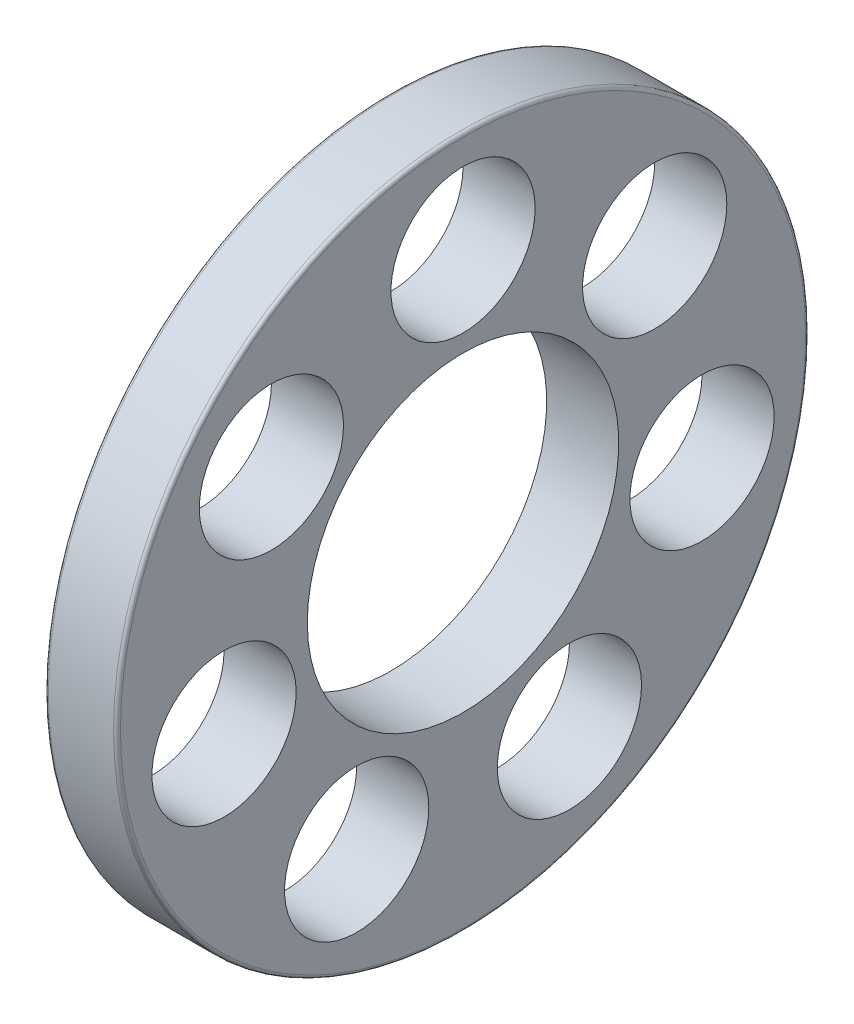
ISO-10303-21;
HEADER;
FILE_DESCRIPTION(('STEP AP214'),'2;1');
FILE_NAME('part.step','',(''),(''),'','','');
FILE_SCHEMA(('AUTOMOTIVE_DESIGN { 1 0 10303 214 1 1 1 1 }'));
ENDSEC;
DATA;
#1=APPLICATION_CONTEXT('core data for automotive mechanical design processes');
#2=APPLICATION_PROTOCOL_DEFINITION('international standard','automotive_design',2000,#1);
#3=PRODUCT_CONTEXT('',#1,'mechanical');
#4=PRODUCT('Part','Part','',(#3));
#5=PRODUCT_RELATED_PRODUCT_CATEGORY('part','',(#4));
#6=PRODUCT_DEFINITION_FORMATION('','',#4);
#7=PRODUCT_DEFINITION_CONTEXT('part definition',#1,'design');
#8=PRODUCT_DEFINITION('design','',#6,#7);
#9=PRODUCT_DEFINITION_SHAPE('','',#8);
#10=(LENGTH_UNIT() NAMED_UNIT(*) SI_UNIT(.MILLI.,.METRE.));
#11=(NAMED_UNIT(*) PLANE_ANGLE_UNIT() SI_UNIT($,.RADIAN.));
#12=(NAMED_UNIT(*) SI_UNIT($,.STERADIAN.) SOLID_ANGLE_UNIT());
#13=UNCERTAINTY_MEASURE_WITH_UNIT(LENGTH_MEASURE(1.E-05),#10,'distance_accuracy_value','');
#14=(GEOMETRIC_REPRESENTATION_CONTEXT(3) GLOBAL_UNCERTAINTY_ASSIGNED_CONTEXT((#13)) GLOBAL_UNIT_ASSIGNED_CONTEXT((#10,
#11,#12)) REPRESENTATION_CONTEXT('',''));
#15=CARTESIAN_POINT('',(0.,0.,0.));
#16=DIRECTION('',(0.,0.,1.));
#17=DIRECTION('',(1.,0.,0.));
#18=AXIS2_PLACEMENT_3D('',#15,#16,#17);
#19=CARTESIAN_POINT('',(9.17499999999999,0.,0.));
#20=DIRECTION('',(1.,0.,0.));
#21=DIRECTION('',(0.,0.,-1.));
#22=AXIS2_PLACEMENT_3D('',#19,#20,#21);
#23=TOROIDAL_SURFACE('',#22,29.7,0.299999999999995);
#24=CARTESIAN_POINT('',(9.175,0.,0.));
#25=DIRECTION('',(-1.,0.,0.));
#26=DIRECTION('',(0.,0.,1.));
#27=AXIS2_PLACEMENT_3D('',#24,#25,#26);
#28=CIRCLE('',#27,30.);
#29=CARTESIAN_POINT('',(9.175,0.,30.));
#30=VERTEX_POINT('',#29);
#31=EDGE_CURVE('E85',#30,#30,#28,.F.);
#32=ORIENTED_EDGE('',*,*,#31,.F.);
#33=EDGE_LOOP('',(#32));
#34=FACE_BOUND('',#33,.T.);
#35=CARTESIAN_POINT('',(8.875,0.,0.));
#36=DIRECTION('',(1.,0.,0.));
#37=DIRECTION('',(0.,0.,-1.));
#38=AXIS2_PLACEMENT_3D('',#35,#36,#37);
#39=CIRCLE('',#38,29.7);
#40=CARTESIAN_POINT('',(8.875,0.,-29.7));
#41=VERTEX_POINT('',#40);
#42=EDGE_CURVE('E80',#41,#41,#39,.F.);
#43=ORIENTED_EDGE('',*,*,#42,.F.);
#44=EDGE_LOOP('',(#43));
#45=FACE_BOUND('',#44,.T.);
#46=ADVANCED_FACE('F15',(#34,#45),#23,.T.);
#47=CARTESIAN_POINT('',(15.125,0.,0.));
#48=DIRECTION('',(-1.,0.,0.));
#49=DIRECTION('',(0.,0.,1.));
#50=AXIS2_PLACEMENT_3D('',#47,#48,#49);
#51=CYLINDRICAL_SURFACE('',#50,30.);
#52=CARTESIAN_POINT('',(14.825,0.,0.));
#53=DIRECTION('',(1.,0.,0.));
#54=DIRECTION('',(0.,0.,-1.));
#55=AXIS2_PLACEMENT_3D('',#52,#53,#54);
#56=CIRCLE('',#55,30.);
#57=CARTESIAN_POINT('',(14.825,0.,-30.));
#58=VERTEX_POINT('',#57);
#59=EDGE_CURVE('E76',#58,#58,#56,.T.);
#60=ORIENTED_EDGE('',*,*,#59,.F.);
#61=EDGE_LOOP('',(#60));
#62=FACE_BOUND('',#61,.T.);
#63=ORIENTED_EDGE('',*,*,#31,.T.);
#64=EDGE_LOOP('',(#63));
#65=FACE_BOUND('',#64,.T.);
#66=ADVANCED_FACE('F116',(#62,#65),#51,.T.);
#67=CARTESIAN_POINT('',(8.875,29.7,0.));
#68=DIRECTION('',(-1.,0.,0.));
#69=DIRECTION('',(0.,0.,1.));
#70=AXIS2_PLACEMENT_3D('',#67,#68,#69);
#71=PLANE('',#70);
#72=ORIENTED_EDGE('',*,*,#42,.T.);
#73=EDGE_LOOP('',(#72));
#74=FACE_BOUND('',#73,.T.);
#75=CARTESIAN_POINT('',(8.875,13.2491582894981,16.6139190024456));
#76=DIRECTION('',(1.,0.,0.));
#77=DIRECTION('',(0.,0.,-1.));
#78=AXIS2_PLACEMENT_3D('',#75,#76,#77);
#79=CIRCLE('',#78,6.25);
#80=CARTESIAN_POINT('',(8.875,13.2491582894981,10.3639190024456));
#81=VERTEX_POINT('',#80);
#82=EDGE_CURVE('E57',#81,#81,#79,.T.);
#83=ORIENTED_EDGE('',*,*,#82,.T.);
#84=EDGE_LOOP('',(#83));
#85=FACE_BOUND('',#84,.T.);
#86=CARTESIAN_POINT('',(8.875,-4.72856984657168,20.7172181338638));
#87=DIRECTION('',(1.,0.,0.));
#88=DIRECTION('',(0.,0.,-1.));
#89=AXIS2_PLACEMENT_3D('',#86,#87,#88);
#90=CIRCLE('',#89,6.25);
#91=CARTESIAN_POINT('',(8.875,-4.72856984657168,14.4672181338638));
#92=VERTEX_POINT('',#91);
#93=EDGE_CURVE('E60',#92,#92,#90,.T.);
#94=ORIENTED_EDGE('',*,*,#93,.T.);
#95=EDGE_LOOP('',(#94));
#96=FACE_BOUND('',#95,.T.);
#97=CARTESIAN_POINT('',(8.875,-19.1455884429264,9.22002945624811));
#98=DIRECTION('',(1.,0.,0.));
#99=DIRECTION('',(0.,0.,-1.));
#100=AXIS2_PLACEMENT_3D('',#97,#98,#99);
#101=CIRCLE('',#100,6.25);
#102=CARTESIAN_POINT('',(8.875,-19.1455884429264,2.97002945624811));
#103=VERTEX_POINT('',#102);
#104=EDGE_CURVE('E63',#103,#103,#101,.T.);
#105=ORIENTED_EDGE('',*,*,#104,.T.);
#106=EDGE_LOOP('',(#105));
#107=FACE_BOUND('',#106,.T.);
#108=CARTESIAN_POINT('',(8.875,-19.1455884429264,-9.22002945624811));
#109=DIRECTION('',(1.,0.,0.));
#110=DIRECTION('',(0.,0.,-1.));
#111=AXIS2_PLACEMENT_3D('',#108,#109,#110);
#112=CIRCLE('',#111,6.25);
#113=CARTESIAN_POINT('',(8.875,-19.1455884429264,-15.4700294562481));
#114=VERTEX_POINT('',#113);
#115=EDGE_CURVE('E66',#114,#114,#112,.T.);
#116=ORIENTED_EDGE('',*,*,#115,.T.);
#117=EDGE_LOOP('',(#116));
#118=FACE_BOUND('',#117,.T.);
#119=CARTESIAN_POINT('',(8.875,-4.72856984657169,-20.7172181338638));
#120=DIRECTION('',(1.,0.,0.));
#121=DIRECTION('',(0.,0.,-1.));
#122=AXIS2_PLACEMENT_3D('',#119,#120,#121);
#123=CIRCLE('',#122,6.25);
#124=CARTESIAN_POINT('',(8.875,-4.72856984657169,-26.9672181338638));
#125=VERTEX_POINT('',#124);
#126=EDGE_CURVE('E69',#125,#125,#123,.T.);
#127=ORIENTED_EDGE('',*,*,#126,.T.);
#128=EDGE_LOOP('',(#127));
#129=FACE_BOUND('',#128,.T.);
#130=CARTESIAN_POINT('',(8.875,13.2491582894981,-16.6139190024456));
#131=DIRECTION('',(1.,0.,0.));
#132=DIRECTION('',(0.,0.,-1.));
#133=AXIS2_PLACEMENT_3D('',#130,#131,#132);
#134=CIRCLE('',#133,6.25);
#135=CARTESIAN_POINT('',(8.875,13.2491582894981,-22.8639190024456));
#136=VERTEX_POINT('',#135);
#137=EDGE_CURVE('E71',#136,#136,#134,.T.);
#138=ORIENTED_EDGE('',*,*,#137,.T.);
#139=EDGE_LOOP('',(#138));
#140=FACE_BOUND('',#139,.T.);
#141=CARTESIAN_POINT('',(8.875,21.25,0.));
#142=DIRECTION('',(1.,0.,0.));
#143=DIRECTION('',(0.,0.,-1.));
#144=AXIS2_PLACEMENT_3D('',#141,#142,#143);
#145=CIRCLE('',#144,6.25);
#146=CARTESIAN_POINT('',(8.875,21.25,-6.25));
#147=VERTEX_POINT('',#146);
#148=EDGE_CURVE('E20',#147,#147,#145,.T.);
#149=ORIENTED_EDGE('',*,*,#148,.T.);
#150=EDGE_LOOP('',(#149));
#151=FACE_BOUND('',#150,.T.);
#152=CARTESIAN_POINT('',(8.875,0.,0.));
#153=DIRECTION('',(-1.,0.,0.));
#154=DIRECTION('',(0.,0.,1.));
#155=AXIS2_PLACEMENT_3D('',#152,#153,#154);
#156=CIRCLE('',#155,13.5);
#157=CARTESIAN_POINT('',(8.875,0.,13.5));
#158=VERTEX_POINT('',#157);
#159=EDGE_CURVE('E54',#158,#158,#156,.F.);
#160=ORIENTED_EDGE('',*,*,#159,.T.);
#161=EDGE_LOOP('',(#160));
#162=FACE_BOUND('',#161,.T.);
#163=ADVANCED_FACE('F112',(#74,#85,#96,#107,#118,#129,#140,#151,#162),#71,.T.);
#164=CARTESIAN_POINT('',(14.825,0.,0.));
#165=DIRECTION('',(1.,0.,0.));
#166=DIRECTION('',(0.,0.,-1.));
#167=AXIS2_PLACEMENT_3D('',#164,#165,#166);
#168=TOROIDAL_SURFACE('',#167,29.7,0.299999999999993);
#169=CARTESIAN_POINT('',(15.125,0.,0.));
#170=DIRECTION('',(-1.,0.,0.));
#171=DIRECTION('',(0.,0.,-1.));
#172=AXIS2_PLACEMENT_3D('',#169,#170,#171);
#173=CIRCLE('',#172,29.7);
#174=CARTESIAN_POINT('',(15.125,0.,-29.7));
#175=VERTEX_POINT('',#174);
#176=EDGE_CURVE('E53',#175,#175,#173,.F.);
#177=ORIENTED_EDGE('',*,*,#176,.F.);
#178=EDGE_LOOP('',(#177));
#179=FACE_BOUND('',#178,.T.);
#180=ORIENTED_EDGE('',*,*,#59,.T.);
#181=EDGE_LOOP('',(#180));
#182=FACE_BOUND('',#181,.T.);
#183=ADVANCED_FACE('F101',(#179,#182),#168,.T.);
#184=CARTESIAN_POINT('',(24.,21.25,0.));
#185=DIRECTION('',(1.,0.,0.));
#186=DIRECTION('',(0.,0.,-1.));
#187=AXIS2_PLACEMENT_3D('',#184,#185,#186);
#188=CYLINDRICAL_SURFACE('',#187,6.25);
#189=CARTESIAN_POINT('',(15.125,21.25,0.));
#190=DIRECTION('',(1.,0.,0.));
#191=DIRECTION('',(0.,0.,-1.));
#192=AXIS2_PLACEMENT_3D('',#189,#190,#191);
#193=CIRCLE('',#192,6.25);
#194=CARTESIAN_POINT('',(15.125,21.25,-6.25));
#195=VERTEX_POINT('',#194);
#196=EDGE_CURVE('E50',#195,#195,#193,.F.);
#197=ORIENTED_EDGE('',*,*,#196,.F.);
#198=EDGE_LOOP('',(#197));
#199=FACE_BOUND('',#198,.T.);
#200=ORIENTED_EDGE('',*,*,#148,.F.);
#201=EDGE_LOOP('',(#200));
#202=FACE_BOUND('',#201,.T.);
#203=ADVANCED_FACE('F111',(#199,#202),#188,.F.);
#204=CARTESIAN_POINT('',(24.,13.2491582894981,-16.6139190024456));
#205=DIRECTION('',(1.,0.,0.));
#206=DIRECTION('',(0.,0.,-1.));
#207=AXIS2_PLACEMENT_3D('',#204,#205,#206);
#208=CYLINDRICAL_SURFACE('',#207,6.25);
#209=CARTESIAN_POINT('',(15.125,13.2491582894981,-16.6139190024456));
#210=DIRECTION('',(1.,0.,0.));
#211=DIRECTION('',(0.,0.,-1.));
#212=AXIS2_PLACEMENT_3D('',#209,#210,#211);
#213=CIRCLE('',#212,6.25);
#214=CARTESIAN_POINT('',(15.125,13.2491582894981,-22.8639190024456));
#215=VERTEX_POINT('',#214);
#216=EDGE_CURVE('E47',#215,#215,#213,.F.);
#217=ORIENTED_EDGE('',*,*,#216,.F.);
#218=EDGE_LOOP('',(#217));
#219=FACE_BOUND('',#218,.T.);
#220=ORIENTED_EDGE('',*,*,#137,.F.);
#221=EDGE_LOOP('',(#220));
#222=FACE_BOUND('',#221,.T.);
#223=ADVANCED_FACE('F175',(#219,#222),#208,.F.);
#224=CARTESIAN_POINT('',(24.,-4.72856984657169,-20.7172181338638));
#225=DIRECTION('',(1.,0.,0.));
#226=DIRECTION('',(0.,0.,-1.));
#227=AXIS2_PLACEMENT_3D('',#224,#225,#226);
#228=CYLINDRICAL_SURFACE('',#227,6.25);
#229=CARTESIAN_POINT('',(15.125,-4.72856984657169,-20.7172181338638));
#230=DIRECTION('',(1.,0.,0.));
#231=DIRECTION('',(0.,0.,-1.));
#232=AXIS2_PLACEMENT_3D('',#229,#230,#231);
#233=CIRCLE('',#232,6.25);
#234=CARTESIAN_POINT('',(15.125,-4.72856984657169,-26.9672181338638));
#235=VERTEX_POINT('',#234);
#236=EDGE_CURVE('E44',#235,#235,#233,.F.);
#237=ORIENTED_EDGE('',*,*,#236,.F.);
#238=EDGE_LOOP('',(#237));
#239=FACE_BOUND('',#238,.T.);
#240=ORIENTED_EDGE('',*,*,#126,.F.);
#241=EDGE_LOOP('',(#240));
#242=FACE_BOUND('',#241,.T.);
#243=ADVANCED_FACE('F172',(#239,#242),#228,.F.);
#244=CARTESIAN_POINT('',(24.,-19.1455884429264,-9.22002945624811));
#245=DIRECTION('',(1.,0.,0.));
#246=DIRECTION('',(0.,0.,-1.));
#247=AXIS2_PLACEMENT_3D('',#244,#245,#246);
#248=CYLINDRICAL_SURFACE('',#247,6.25);
#249=CARTESIAN_POINT('',(15.125,-19.1455884429264,-9.22002945624811));
#250=DIRECTION('',(1.,0.,0.));
#251=DIRECTION('',(0.,0.,-1.));
#252=AXIS2_PLACEMENT_3D('',#249,#250,#251);
#253=CIRCLE('',#252,6.25);
#254=CARTESIAN_POINT('',(15.125,-19.1455884429264,-15.4700294562481));
#255=VERTEX_POINT('',#254);
#256=EDGE_CURVE('E41',#255,#255,#253,.F.);
#257=ORIENTED_EDGE('',*,*,#256,.F.);
#258=EDGE_LOOP('',(#257));
#259=FACE_BOUND('',#258,.T.);
#260=ORIENTED_EDGE('',*,*,#115,.F.);
#261=EDGE_LOOP('',(#260));
#262=FACE_BOUND('',#261,.T.);
#263=ADVANCED_FACE('F168',(#259,#262),#248,.F.);
#264=CARTESIAN_POINT('',(24.,-19.1455884429264,9.22002945624811));
#265=DIRECTION('',(1.,0.,0.));
#266=DIRECTION('',(0.,0.,-1.));
#267=AXIS2_PLACEMENT_3D('',#264,#265,#266);
#268=CYLINDRICAL_SURFACE('',#267,6.25);
#269=CARTESIAN_POINT('',(15.125,-19.1455884429264,9.22002945624811));
#270=DIRECTION('',(1.,0.,0.));
#271=DIRECTION('',(0.,0.,-1.));
#272=AXIS2_PLACEMENT_3D('',#269,#270,#271);
#273=CIRCLE('',#272,6.25);
#274=CARTESIAN_POINT('',(15.125,-19.1455884429264,2.97002945624811));
#275=VERTEX_POINT('',#274);
#276=EDGE_CURVE('E38',#275,#275,#273,.F.);
#277=ORIENTED_EDGE('',*,*,#276,.F.);
#278=EDGE_LOOP('',(#277));
#279=FACE_BOUND('',#278,.T.);
#280=ORIENTED_EDGE('',*,*,#104,.F.);
#281=EDGE_LOOP('',(#280));
#282=FACE_BOUND('',#281,.T.);
#283=ADVANCED_FACE('F164',(#279,#282),#268,.F.);
#284=CARTESIAN_POINT('',(24.,-4.72856984657168,20.7172181338638));
#285=DIRECTION('',(1.,0.,0.));
#286=DIRECTION('',(0.,0.,-1.));
#287=AXIS2_PLACEMENT_3D('',#284,#285,#286);
#288=CYLINDRICAL_SURFACE('',#287,6.25);
#289=CARTESIAN_POINT('',(15.125,-4.72856984657168,20.7172181338638));
#290=DIRECTION('',(1.,0.,0.));
#291=DIRECTION('',(0.,0.,-1.));
#292=AXIS2_PLACEMENT_3D('',#289,#290,#291);
#293=CIRCLE('',#292,6.25);
#294=CARTESIAN_POINT('',(15.125,-4.72856984657168,14.4672181338638));
#295=VERTEX_POINT('',#294);
#296=EDGE_CURVE('E29',#295,#295,#293,.F.);
#297=ORIENTED_EDGE('',*,*,#296,.F.);
#298=EDGE_LOOP('',(#297));
#299=FACE_BOUND('',#298,.T.);
#300=ORIENTED_EDGE('',*,*,#93,.F.);
#301=EDGE_LOOP('',(#300));
#302=FACE_BOUND('',#301,.T.);
#303=ADVANCED_FACE('F157',(#299,#302),#288,.F.);
#304=CARTESIAN_POINT('',(24.,13.2491582894981,16.6139190024456));
#305=DIRECTION('',(1.,0.,0.));
#306=DIRECTION('',(0.,0.,-1.));
#307=AXIS2_PLACEMENT_3D('',#304,#305,#306);
#308=CYLINDRICAL_SURFACE('',#307,6.25);
#309=CARTESIAN_POINT('',(15.125,13.2491582894981,16.6139190024456));
#310=DIRECTION('',(1.,0.,0.));
#311=DIRECTION('',(0.,0.,-1.));
#312=AXIS2_PLACEMENT_3D('',#309,#310,#311);
#313=CIRCLE('',#312,6.25);
#314=CARTESIAN_POINT('',(15.125,13.2491582894981,10.3639190024456));
#315=VERTEX_POINT('',#314);
#316=EDGE_CURVE('E24',#315,#315,#313,.F.);
#317=ORIENTED_EDGE('',*,*,#316,.F.);
#318=EDGE_LOOP('',(#317));
#319=FACE_BOUND('',#318,.T.);
#320=ORIENTED_EDGE('',*,*,#82,.F.);
#321=EDGE_LOOP('',(#320));
#322=FACE_BOUND('',#321,.T.);
#323=ADVANCED_FACE('F149',(#319,#322),#308,.F.);
#324=CARTESIAN_POINT('',(15.125,0.,0.));
#325=DIRECTION('',(-1.,0.,0.));
#326=DIRECTION('',(0.,0.,1.));
#327=AXIS2_PLACEMENT_3D('',#324,#325,#326);
#328=CYLINDRICAL_SURFACE('',#327,13.5);
#329=ORIENTED_EDGE('',*,*,#159,.F.);
#330=EDGE_LOOP('',(#329));
#331=FACE_BOUND('',#330,.T.);
#332=CARTESIAN_POINT('',(15.125,0.,0.));
#333=DIRECTION('',(-1.,0.,0.));
#334=DIRECTION('',(0.,0.,1.));
#335=AXIS2_PLACEMENT_3D('',#332,#333,#334);
#336=CIRCLE('',#335,13.5);
#337=CARTESIAN_POINT('',(15.125,0.,13.5));
#338=VERTEX_POINT('',#337);
#339=EDGE_CURVE('E10',#338,#338,#336,.T.);
#340=ORIENTED_EDGE('',*,*,#339,.F.);
#341=EDGE_LOOP('',(#340));
#342=FACE_BOUND('',#341,.T.);
#343=ADVANCED_FACE('F145',(#331,#342),#328,.F.);
#344=CARTESIAN_POINT('',(15.125,13.5,0.));
#345=DIRECTION('',(1.,0.,0.));
#346=DIRECTION('',(0.,0.,-1.));
#347=AXIS2_PLACEMENT_3D('',#344,#345,#346);
#348=PLANE('',#347);
#349=ORIENTED_EDGE('',*,*,#339,.T.);
#350=EDGE_LOOP('',(#349));
#351=FACE_BOUND('',#350,.T.);
#352=ORIENTED_EDGE('',*,*,#316,.T.);
#353=EDGE_LOOP('',(#352));
#354=FACE_BOUND('',#353,.T.);
#355=ORIENTED_EDGE('',*,*,#296,.T.);
#356=EDGE_LOOP('',(#355));
#357=FACE_BOUND('',#356,.T.);
#358=ORIENTED_EDGE('',*,*,#276,.T.);
#359=EDGE_LOOP('',(#358));
#360=FACE_BOUND('',#359,.T.);
#361=ORIENTED_EDGE('',*,*,#256,.T.);
#362=EDGE_LOOP('',(#361));
#363=FACE_BOUND('',#362,.T.);
#364=ORIENTED_EDGE('',*,*,#236,.T.);
#365=EDGE_LOOP('',(#364));
#366=FACE_BOUND('',#365,.T.);
#367=ORIENTED_EDGE('',*,*,#216,.T.);
#368=EDGE_LOOP('',(#367));
#369=FACE_BOUND('',#368,.T.);
#370=ORIENTED_EDGE('',*,*,#196,.T.);
#371=EDGE_LOOP('',(#370));
#372=FACE_BOUND('',#371,.T.);
#373=ORIENTED_EDGE('',*,*,#176,.T.);
#374=EDGE_LOOP('',(#373));
#375=FACE_BOUND('',#374,.T.);
#376=ADVANCED_FACE('F148',(#351,#354,#357,#360,#363,#366,#369,#372,#375),#348,.T.);
#377=CLOSED_SHELL('',(#46,#66,#163,#183,#203,#223,#243,#263,#283,#303,#323,#343,#376));
#378=MANIFOLD_SOLID_BREP('B1',#377);
#379=ADVANCED_BREP_SHAPE_REPRESENTATION('',(#18,#378),#14);
#380=SHAPE_DEFINITION_REPRESENTATION(#9,#379);
ENDSEC;
END-ISO-10303-21;
